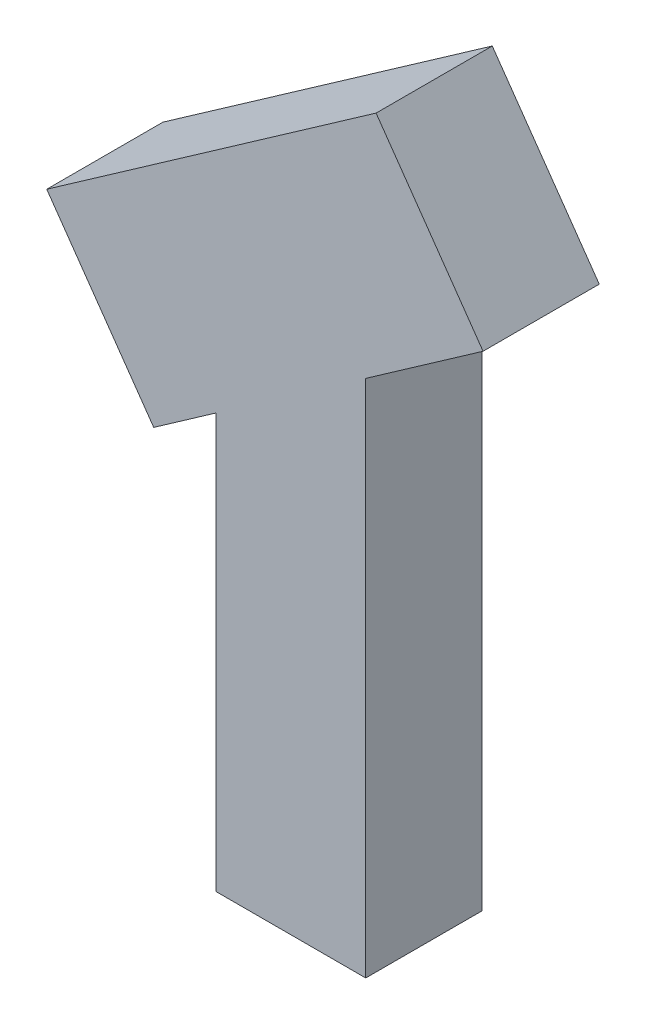
ISO-10303-21;
HEADER;
FILE_DESCRIPTION(('STEP AP214'),'2;1');
FILE_NAME('part.step','',(''),(''),'','','');
FILE_SCHEMA(('AUTOMOTIVE_DESIGN { 1 0 10303 214 1 1 1 1 }'));
ENDSEC;
DATA;
#1=APPLICATION_CONTEXT('core data for automotive mechanical design processes');
#2=APPLICATION_PROTOCOL_DEFINITION('international standard','automotive_design',2000,#1);
#3=PRODUCT_CONTEXT('',#1,'mechanical');
#4=PRODUCT('Part','Part','',(#3));
#5=PRODUCT_RELATED_PRODUCT_CATEGORY('part','',(#4));
#6=PRODUCT_DEFINITION_FORMATION('','',#4);
#7=PRODUCT_DEFINITION_CONTEXT('part definition',#1,'design');
#8=PRODUCT_DEFINITION('design','',#6,#7);
#9=PRODUCT_DEFINITION_SHAPE('','',#8);
#10=(LENGTH_UNIT() NAMED_UNIT(*) SI_UNIT(.MILLI.,.METRE.));
#11=(NAMED_UNIT(*) PLANE_ANGLE_UNIT() SI_UNIT($,.RADIAN.));
#12=(NAMED_UNIT(*) SI_UNIT($,.STERADIAN.) SOLID_ANGLE_UNIT());
#13=UNCERTAINTY_MEASURE_WITH_UNIT(LENGTH_MEASURE(1.E-05),#10,'distance_accuracy_value','');
#14=(GEOMETRIC_REPRESENTATION_CONTEXT(3) GLOBAL_UNCERTAINTY_ASSIGNED_CONTEXT((#13)) GLOBAL_UNIT_ASSIGNED_CONTEXT((#10,
#11,#12)) REPRESENTATION_CONTEXT('',''));
#15=CARTESIAN_POINT('',(0.,0.,0.));
#16=DIRECTION('',(0.,0.,1.));
#17=DIRECTION('',(1.,0.,0.));
#18=AXIS2_PLACEMENT_3D('',#15,#16,#17);
#19=CARTESIAN_POINT('',(-1.07954916287739,-361.,38.));
#20=DIRECTION('',(0.,1.,0.));
#21=DIRECTION('',(0.,0.,1.));
#22=AXIS2_PLACEMENT_3D('',#19,#20,#21);
#23=PLANE('',#22);
#24=DIRECTION('',(1.,0.,0.));
#25=VECTOR('',#24,1.);
#26=CARTESIAN_POINT('',(-1.07954916287739,-361.,-38.));
#27=LINE('',#26,#25);
#28=CARTESIAN_POINT('',(-36.0795491628774,-361.,-38.));
#29=VERTEX_POINT('',#28);
#30=CARTESIAN_POINT('',(61.9204508371226,-361.,-38.));
#31=VERTEX_POINT('',#30);
#32=EDGE_CURVE('E95',#29,#31,#27,.T.);
#33=ORIENTED_EDGE('',*,*,#32,.T.);
#34=DIRECTION('',(0.,0.,-1.));
#35=VECTOR('',#34,1.);
#36=CARTESIAN_POINT('',(61.9204508371226,-361.,38.));
#37=LINE('',#36,#35);
#38=CARTESIAN_POINT('',(61.9204508371226,-361.,38.));
#39=VERTEX_POINT('',#38);
#40=EDGE_CURVE('E174',#39,#31,#37,.T.);
#41=ORIENTED_EDGE('',*,*,#40,.F.);
#42=DIRECTION('',(1.,0.,0.));
#43=VECTOR('',#42,1.);
#44=CARTESIAN_POINT('',(-1.07954916287739,-361.,38.));
#45=LINE('',#44,#43);
#46=CARTESIAN_POINT('',(-36.0795491628774,-361.,38.));
#47=VERTEX_POINT('',#46);
#48=EDGE_CURVE('E101',#47,#39,#45,.T.);
#49=ORIENTED_EDGE('',*,*,#48,.F.);
#50=DIRECTION('',(0.,0.,-1.));
#51=VECTOR('',#50,1.);
#52=CARTESIAN_POINT('',(-36.0795491628774,-361.,38.));
#53=LINE('',#52,#51);
#54=EDGE_CURVE('E142',#47,#29,#53,.T.);
#55=ORIENTED_EDGE('',*,*,#54,.T.);
#56=EDGE_LOOP('',(#33,#41,#49,#55));
#57=FACE_BOUND('',#56,.T.);
#58=ADVANCED_FACE('F39',(#57),#23,.F.);
#59=CARTESIAN_POINT('',(61.9204508371226,-361.,38.));
#60=DIRECTION('',(-1.,0.,0.));
#61=DIRECTION('',(0.,0.,1.));
#62=AXIS2_PLACEMENT_3D('',#59,#60,#61);
#63=PLANE('',#62);
#64=DIRECTION('',(0.,1.,0.));
#65=VECTOR('',#64,1.);
#66=CARTESIAN_POINT('',(61.9204508371226,-361.,-38.));
#67=LINE('',#66,#65);
#68=CARTESIAN_POINT('',(61.9204508371226,-21.313279486295,-38.));
#69=VERTEX_POINT('',#68);
#70=EDGE_CURVE('E147',#31,#69,#67,.T.);
#71=ORIENTED_EDGE('',*,*,#70,.T.);
#72=DIRECTION('',(0.,0.,-1.));
#73=VECTOR('',#72,1.);
#74=CARTESIAN_POINT('',(61.9204508371226,-21.313279486295,38.));
#75=LINE('',#74,#73);
#76=CARTESIAN_POINT('',(61.9204508371226,-21.313279486295,38.));
#77=VERTEX_POINT('',#76);
#78=EDGE_CURVE('E171',#77,#69,#75,.T.);
#79=ORIENTED_EDGE('',*,*,#78,.F.);
#80=DIRECTION('',(0.,1.,0.));
#81=VECTOR('',#80,1.);
#82=CARTESIAN_POINT('',(61.9204508371226,-361.,38.));
#83=LINE('',#82,#81);
#84=EDGE_CURVE('E214',#39,#77,#83,.T.);
#85=ORIENTED_EDGE('',*,*,#84,.F.);
#86=ORIENTED_EDGE('',*,*,#40,.T.);
#87=EDGE_LOOP('',(#71,#79,#85,#86));
#88=FACE_BOUND('',#87,.T.);
#89=ADVANCED_FACE('F235',(#88),#63,.F.);
#90=CARTESIAN_POINT('',(61.9204508371226,-21.313279486295,38.));
#91=DIRECTION('',(-0.573576436351042,0.819152044288995,0.));
#92=DIRECTION('',(-0.819152044288995,-0.573576436351042,0.));
#93=AXIS2_PLACEMENT_3D('',#90,#91,#92);
#94=PLANE('',#93);
#95=DIRECTION('',(0.819152044288995,0.573576436351042,0.));
#96=VECTOR('',#95,1.);
#97=CARTESIAN_POINT('',(61.9204508371226,-21.313279486295,-38.));
#98=LINE('',#97,#96);
#99=CARTESIAN_POINT('',(138.671836045079,32.4286190043527,-38.));
#100=VERTEX_POINT('',#99);
#101=EDGE_CURVE('E150',#69,#100,#98,.T.);
#102=ORIENTED_EDGE('',*,*,#101,.T.);
#103=DIRECTION('',(0.,0.,-1.));
#104=VECTOR('',#103,1.);
#105=CARTESIAN_POINT('',(138.671836045079,32.4286190043527,38.));
#106=LINE('',#105,#104);
#107=CARTESIAN_POINT('',(138.671836045079,32.4286190043527,38.));
#108=VERTEX_POINT('',#107);
#109=EDGE_CURVE('E168',#108,#100,#106,.T.);
#110=ORIENTED_EDGE('',*,*,#109,.F.);
#111=DIRECTION('',(0.819152044288995,0.573576436351042,0.));
#112=VECTOR('',#111,1.);
#113=CARTESIAN_POINT('',(61.9204508371226,-21.313279486295,38.));
#114=LINE('',#113,#112);
#115=EDGE_CURVE('E216',#77,#108,#114,.T.);
#116=ORIENTED_EDGE('',*,*,#115,.F.);
#117=ORIENTED_EDGE('',*,*,#78,.T.);
#118=EDGE_LOOP('',(#102,#110,#116,#117));
#119=FACE_BOUND('',#118,.T.);
#120=ADVANCED_FACE('F238',(#119),#94,.F.);
#121=CARTESIAN_POINT('',(138.671836045079,32.4286190043527,38.));
#122=DIRECTION('',(-0.819152044288995,-0.573576436351042,0.));
#123=DIRECTION('',(0.573576436351042,-0.819152044288995,0.));
#124=AXIS2_PLACEMENT_3D('',#121,#122,#123);
#125=PLANE('',#124);
#126=DIRECTION('',(-0.573576436351042,0.819152044288995,0.));
#127=VECTOR('',#126,1.);
#128=CARTESIAN_POINT('',(138.671836045079,32.4286190043527,-38.));
#129=LINE('',#128,#127);
#130=CARTESIAN_POINT('',(68.6955108102518,132.36516840761,-38.));
#131=VERTEX_POINT('',#130);
#132=EDGE_CURVE('E152',#100,#131,#129,.T.);
#133=ORIENTED_EDGE('',*,*,#132,.T.);
#134=DIRECTION('',(0.,0.,-1.));
#135=VECTOR('',#134,1.);
#136=CARTESIAN_POINT('',(68.6955108102518,132.36516840761,38.));
#137=LINE('',#136,#135);
#138=CARTESIAN_POINT('',(68.6955108102518,132.36516840761,38.));
#139=VERTEX_POINT('',#138);
#140=EDGE_CURVE('E165',#139,#131,#137,.T.);
#141=ORIENTED_EDGE('',*,*,#140,.F.);
#142=DIRECTION('',(-0.573576436351042,0.819152044288995,0.));
#143=VECTOR('',#142,1.);
#144=CARTESIAN_POINT('',(138.671836045079,32.4286190043527,38.));
#145=LINE('',#144,#143);
#146=EDGE_CURVE('E218',#108,#139,#145,.T.);
#147=ORIENTED_EDGE('',*,*,#146,.F.);
#148=ORIENTED_EDGE('',*,*,#109,.T.);
#149=EDGE_LOOP('',(#133,#141,#147,#148));
#150=FACE_BOUND('',#149,.T.);
#151=ADVANCED_FACE('F224',(#150),#125,.F.);
#152=CARTESIAN_POINT('',(68.6955108102518,132.36516840761,38.));
#153=DIRECTION('',(0.573576436351042,-0.819152044288995,0.));
#154=DIRECTION('',(0.819152044288995,0.573576436351042,0.));
#155=AXIS2_PLACEMENT_3D('',#152,#153,#154);
#156=PLANE('',#155);
#157=DIRECTION('',(-0.819152044288994,-0.573576436351042,0.));
#158=VECTOR('',#157,1.);
#159=CARTESIAN_POINT('',(68.6955108102518,132.36516840761,-38.));
#160=LINE('',#159,#158);
#161=CARTESIAN_POINT('',(-146.741476837754,-18.485434352714,-38.));
#162=VERTEX_POINT('',#161);
#163=EDGE_CURVE('E154',#131,#162,#160,.T.);
#164=ORIENTED_EDGE('',*,*,#163,.T.);
#165=DIRECTION('',(0.,0.,-1.));
#166=VECTOR('',#165,1.);
#167=CARTESIAN_POINT('',(-146.741476837754,-18.485434352714,38.));
#168=LINE('',#167,#166);
#169=CARTESIAN_POINT('',(-146.741476837754,-18.485434352714,38.));
#170=VERTEX_POINT('',#169);
#171=EDGE_CURVE('E136',#170,#162,#168,.T.);
#172=ORIENTED_EDGE('',*,*,#171,.F.);
#173=DIRECTION('',(-0.819152044288994,-0.573576436351042,0.));
#174=VECTOR('',#173,1.);
#175=CARTESIAN_POINT('',(68.6955108102518,132.36516840761,38.));
#176=LINE('',#175,#174);
#177=EDGE_CURVE('E124',#139,#170,#176,.T.);
#178=ORIENTED_EDGE('',*,*,#177,.F.);
#179=ORIENTED_EDGE('',*,*,#140,.T.);
#180=EDGE_LOOP('',(#164,#172,#178,#179));
#181=FACE_BOUND('',#180,.T.);
#182=ADVANCED_FACE('F228',(#181),#156,.F.);
#183=CARTESIAN_POINT('',(-146.741476837754,-18.485434352714,38.));
#184=DIRECTION('',(0.819152044288994,0.573576436351042,0.));
#185=DIRECTION('',(-0.573576436351042,0.819152044288994,0.));
#186=AXIS2_PLACEMENT_3D('',#183,#184,#185);
#187=PLANE('',#186);
#188=DIRECTION('',(0.573576436351042,-0.819152044288994,0.));
#189=VECTOR('',#188,1.);
#190=CARTESIAN_POINT('',(-146.741476837754,-18.485434352714,-38.));
#191=LINE('',#190,#189);
#192=CARTESIAN_POINT('',(-76.7651516029266,-118.421983755971,-38.));
#193=VERTEX_POINT('',#192);
#194=EDGE_CURVE('E133',#162,#193,#191,.T.);
#195=ORIENTED_EDGE('',*,*,#194,.T.);
#196=DIRECTION('',(0.,0.,-1.));
#197=VECTOR('',#196,1.);
#198=CARTESIAN_POINT('',(-76.7651516029266,-118.421983755971,38.));
#199=LINE('',#198,#197);
#200=CARTESIAN_POINT('',(-76.7651516029266,-118.421983755971,38.));
#201=VERTEX_POINT('',#200);
#202=EDGE_CURVE('E130',#201,#193,#199,.T.);
#203=ORIENTED_EDGE('',*,*,#202,.F.);
#204=DIRECTION('',(0.573576436351042,-0.819152044288994,0.));
#205=VECTOR('',#204,1.);
#206=CARTESIAN_POINT('',(-146.741476837754,-18.485434352714,38.));
#207=LINE('',#206,#205);
#208=EDGE_CURVE('E117',#170,#201,#207,.T.);
#209=ORIENTED_EDGE('',*,*,#208,.F.);
#210=ORIENTED_EDGE('',*,*,#171,.T.);
#211=EDGE_LOOP('',(#195,#203,#209,#210));
#212=FACE_BOUND('',#211,.T.);
#213=ADVANCED_FACE('F131',(#212),#187,.F.);
#214=CARTESIAN_POINT('',(-76.7651516029266,-118.421983755971,38.));
#215=DIRECTION('',(-0.573576436351042,0.819152044288995,0.));
#216=DIRECTION('',(-0.819152044288995,-0.573576436351042,0.));
#217=AXIS2_PLACEMENT_3D('',#214,#215,#216);
#218=PLANE('',#217);
#219=DIRECTION('',(0.819152044288995,0.573576436351042,0.));
#220=VECTOR('',#219,1.);
#221=CARTESIAN_POINT('',(-76.7651516029266,-118.421983755971,-38.));
#222=LINE('',#221,#220);
#223=CARTESIAN_POINT('',(-36.0795491628774,-89.9336182308458,-38.));
#224=VERTEX_POINT('',#223);
#225=EDGE_CURVE('E157',#193,#224,#222,.T.);
#226=ORIENTED_EDGE('',*,*,#225,.T.);
#227=DIRECTION('',(0.,0.,-1.));
#228=VECTOR('',#227,1.);
#229=CARTESIAN_POINT('',(-36.0795491628774,-89.9336182308458,38.));
#230=LINE('',#229,#228);
#231=CARTESIAN_POINT('',(-36.0795491628774,-89.9336182308458,38.));
#232=VERTEX_POINT('',#231);
#233=EDGE_CURVE('E137',#232,#224,#230,.T.);
#234=ORIENTED_EDGE('',*,*,#233,.F.);
#235=DIRECTION('',(0.819152044288995,0.573576436351042,0.));
#236=VECTOR('',#235,1.);
#237=CARTESIAN_POINT('',(-76.7651516029266,-118.421983755971,38.));
#238=LINE('',#237,#236);
#239=EDGE_CURVE('E121',#201,#232,#238,.T.);
#240=ORIENTED_EDGE('',*,*,#239,.F.);
#241=ORIENTED_EDGE('',*,*,#202,.T.);
#242=EDGE_LOOP('',(#226,#234,#240,#241));
#243=FACE_BOUND('',#242,.T.);
#244=ADVANCED_FACE('F139',(#243),#218,.F.);
#245=CARTESIAN_POINT('',(-36.0795491628774,-89.9336182308458,38.));
#246=DIRECTION('',(1.,0.,0.));
#247=DIRECTION('',(0.,0.,-1.));
#248=AXIS2_PLACEMENT_3D('',#245,#246,#247);
#249=PLANE('',#248);
#250=DIRECTION('',(0.,-1.,0.));
#251=VECTOR('',#250,1.);
#252=CARTESIAN_POINT('',(-36.0795491628774,-89.9336182308458,-38.));
#253=LINE('',#252,#251);
#254=EDGE_CURVE('E159',#224,#29,#253,.T.);
#255=ORIENTED_EDGE('',*,*,#254,.T.);
#256=ORIENTED_EDGE('',*,*,#54,.F.);
#257=DIRECTION('',(0.,-1.,0.));
#258=VECTOR('',#257,1.);
#259=CARTESIAN_POINT('',(-36.0795491628774,-89.9336182308458,38.));
#260=LINE('',#259,#258);
#261=EDGE_CURVE('E62',#232,#47,#260,.T.);
#262=ORIENTED_EDGE('',*,*,#261,.F.);
#263=ORIENTED_EDGE('',*,*,#233,.T.);
#264=EDGE_LOOP('',(#255,#256,#262,#263));
#265=FACE_BOUND('',#264,.T.);
#266=ADVANCED_FACE('F230',(#265),#249,.F.);
#267=CARTESIAN_POINT('',(0.,0.,38.));
#268=DIRECTION('',(0.,0.,1.));
#269=DIRECTION('',(1.,0.,0.));
#270=AXIS2_PLACEMENT_3D('',#267,#268,#269);
#271=PLANE('',#270);
#272=ORIENTED_EDGE('',*,*,#48,.T.);
#273=ORIENTED_EDGE('',*,*,#84,.T.);
#274=ORIENTED_EDGE('',*,*,#115,.T.);
#275=ORIENTED_EDGE('',*,*,#146,.T.);
#276=ORIENTED_EDGE('',*,*,#177,.T.);
#277=ORIENTED_EDGE('',*,*,#208,.T.);
#278=ORIENTED_EDGE('',*,*,#239,.T.);
#279=ORIENTED_EDGE('',*,*,#261,.T.);
#280=EDGE_LOOP('',(#272,#273,#274,#275,#276,#277,#278,#279));
#281=FACE_BOUND('',#280,.T.);
#282=ADVANCED_FACE('F119',(#281),#271,.T.);
#283=CARTESIAN_POINT('',(0.,0.,-38.));
#284=DIRECTION('',(0.,0.,1.));
#285=DIRECTION('',(1.,0.,0.));
#286=AXIS2_PLACEMENT_3D('',#283,#284,#285);
#287=PLANE('',#286);
#288=DIRECTION('',(-0.573576436351042,0.819152044288995,0.));
#289=VECTOR('',#288,1.);
#290=CARTESIAN_POINT('',(81.254648171023,56.8951171639275,-38.));
#291=LINE('',#290,#289);
#292=CARTESIAN_POINT('',(92.9985844021333,40.1230380441606,-38.));
#293=VERTEX_POINT('',#292);
#294=CARTESIAN_POINT('',(60.3047275301239,86.8147045686334,-38.));
#295=VERTEX_POINT('',#294);
#296=EDGE_CURVE('E46',#293,#295,#291,.T.);
#297=ORIENTED_EDGE('',*,*,#296,.T.);
#298=DIRECTION('',(-0.819152044288995,-0.573576436351042,0.));
#299=VECTOR('',#298,1.);
#300=CARTESIAN_POINT('',(-20.9499206408991,29.9195874047058,-38.));
#301=LINE('',#300,#299);
#302=CARTESIAN_POINT('',(-101.068225194808,-26.179853392522,-38.));
#303=VERTEX_POINT('',#302);
#304=EDGE_CURVE('E11',#295,#303,#301,.T.);
#305=ORIENTED_EDGE('',*,*,#304,.T.);
#306=DIRECTION('',(0.573576436351043,-0.819152044288994,0.));
#307=VECTOR('',#306,1.);
#308=CARTESIAN_POINT('',(-80.1183045539089,-56.0994407972278,-38.));
#309=LINE('',#308,#307);
#310=CARTESIAN_POINT('',(-68.3743683227986,-72.8715199169947,-38.));
#311=VERTEX_POINT('',#310);
#312=EDGE_CURVE('E177',#303,#311,#309,.T.);
#313=ORIENTED_EDGE('',*,*,#312,.T.);
#314=DIRECTION('',(0.819152044288995,0.573576436351042,0.));
#315=VECTOR('',#314,1.);
#316=CARTESIAN_POINT('',(11.7439362311103,-16.7720791197669,-38.));
#317=LINE('',#316,#315);
#318=EDGE_CURVE('E180',#311,#293,#317,.T.);
#319=ORIENTED_EDGE('',*,*,#318,.T.);
#320=EDGE_LOOP('',(#297,#305,#313,#319));
#321=FACE_BOUND('',#320,.T.);
#322=ORIENTED_EDGE('',*,*,#32,.F.);
#323=ORIENTED_EDGE('',*,*,#254,.F.);
#324=ORIENTED_EDGE('',*,*,#225,.F.);
#325=ORIENTED_EDGE('',*,*,#194,.F.);
#326=ORIENTED_EDGE('',*,*,#163,.F.);
#327=ORIENTED_EDGE('',*,*,#132,.F.);
#328=ORIENTED_EDGE('',*,*,#101,.F.);
#329=ORIENTED_EDGE('',*,*,#70,.F.);
#330=EDGE_LOOP('',(#322,#323,#324,#325,#326,#327,#328,#329));
#331=FACE_BOUND('',#330,.T.);
#332=ADVANCED_FACE('F185',(#321,#331),#287,.F.);
#333=CARTESIAN_POINT('',(-20.9499206408991,29.9195874047058,-49.));
#334=DIRECTION('',(-0.573576436351042,0.819152044288995,0.));
#335=DIRECTION('',(-0.819152044288995,-0.573576436351042,0.));
#336=AXIS2_PLACEMENT_3D('',#333,#334,#335);
#337=PLANE('',#336);
#338=DIRECTION('',(0.,0.,1.));
#339=VECTOR('',#338,1.);
#340=CARTESIAN_POINT('',(60.3047275301239,86.8147045686334,-49.));
#341=LINE('',#340,#339);
#342=CARTESIAN_POINT('',(60.3047275301239,86.8147045686334,-27.));
#343=VERTEX_POINT('',#342);
#344=EDGE_CURVE('E148',#295,#343,#341,.T.);
#345=ORIENTED_EDGE('',*,*,#344,.T.);
#346=DIRECTION('',(-0.819152044288995,-0.573576436351042,0.));
#347=VECTOR('',#346,1.);
#348=CARTESIAN_POINT('',(-20.9499206408991,29.9195874047058,-27.));
#349=LINE('',#348,#347);
#350=CARTESIAN_POINT('',(-101.068225194808,-26.179853392522,-27.));
#351=VERTEX_POINT('',#350);
#352=EDGE_CURVE('E399',#343,#351,#349,.T.);
#353=ORIENTED_EDGE('',*,*,#352,.T.);
#354=DIRECTION('',(0.,0.,1.));
#355=VECTOR('',#354,1.);
#356=CARTESIAN_POINT('',(-101.068225194808,-26.179853392522,-49.));
#357=LINE('',#356,#355);
#358=EDGE_CURVE('E206',#303,#351,#357,.T.);
#359=ORIENTED_EDGE('',*,*,#358,.F.);
#360=ORIENTED_EDGE('',*,*,#304,.F.);
#361=EDGE_LOOP('',(#345,#353,#359,#360));
#362=FACE_BOUND('',#361,.T.);
#363=ADVANCED_FACE('F320',(#362),#337,.F.);
#364=CARTESIAN_POINT('',(81.254648171023,56.8951171639275,-49.));
#365=DIRECTION('',(0.819152044288995,0.573576436351042,0.));
#366=DIRECTION('',(-0.573576436351042,0.819152044288995,0.));
#367=AXIS2_PLACEMENT_3D('',#364,#365,#366);
#368=PLANE('',#367);
#369=DIRECTION('',(0.,0.,1.));
#370=VECTOR('',#369,1.);
#371=CARTESIAN_POINT('',(92.9985844021333,40.1230380441606,-49.));
#372=LINE('',#371,#370);
#373=CARTESIAN_POINT('',(92.9985844021333,40.1230380441606,-27.));
#374=VERTEX_POINT('',#373);
#375=EDGE_CURVE('E196',#293,#374,#372,.T.);
#376=ORIENTED_EDGE('',*,*,#375,.T.);
#377=DIRECTION('',(-0.573576436351042,0.819152044288995,0.));
#378=VECTOR('',#377,1.);
#379=CARTESIAN_POINT('',(81.254648171023,56.8951171639275,-27.));
#380=LINE('',#379,#378);
#381=EDGE_CURVE('E212',#374,#343,#380,.T.);
#382=ORIENTED_EDGE('',*,*,#381,.T.);
#383=ORIENTED_EDGE('',*,*,#344,.F.);
#384=ORIENTED_EDGE('',*,*,#296,.F.);
#385=EDGE_LOOP('',(#376,#382,#383,#384));
#386=FACE_BOUND('',#385,.T.);
#387=ADVANCED_FACE('F193',(#386),#368,.F.);
#388=CARTESIAN_POINT('',(11.7439362311103,-16.7720791197669,-49.));
#389=DIRECTION('',(0.573576436351042,-0.819152044288995,0.));
#390=DIRECTION('',(0.819152044288995,0.573576436351042,0.));
#391=AXIS2_PLACEMENT_3D('',#388,#389,#390);
#392=PLANE('',#391);
#393=DIRECTION('',(0.,0.,1.));
#394=VECTOR('',#393,1.);
#395=CARTESIAN_POINT('',(-68.3743683227986,-72.8715199169947,-49.));
#396=LINE('',#395,#394);
#397=CARTESIAN_POINT('',(-68.3743683227986,-72.8715199169947,-27.));
#398=VERTEX_POINT('',#397);
#399=EDGE_CURVE('E53',#311,#398,#396,.T.);
#400=ORIENTED_EDGE('',*,*,#399,.T.);
#401=DIRECTION('',(0.819152044288995,0.573576436351042,0.));
#402=VECTOR('',#401,1.);
#403=CARTESIAN_POINT('',(11.7439362311103,-16.7720791197669,-27.));
#404=LINE('',#403,#402);
#405=EDGE_CURVE('E202',#398,#374,#404,.T.);
#406=ORIENTED_EDGE('',*,*,#405,.T.);
#407=ORIENTED_EDGE('',*,*,#375,.F.);
#408=ORIENTED_EDGE('',*,*,#318,.F.);
#409=EDGE_LOOP('',(#400,#406,#407,#408));
#410=FACE_BOUND('',#409,.T.);
#411=ADVANCED_FACE('F200',(#410),#392,.F.);
#412=CARTESIAN_POINT('',(-80.1183045539089,-56.0994407972278,-49.));
#413=DIRECTION('',(-0.819152044288994,-0.573576436351043,0.));
#414=DIRECTION('',(0.573576436351043,-0.819152044288994,0.));
#415=AXIS2_PLACEMENT_3D('',#412,#413,#414);
#416=PLANE('',#415);
#417=ORIENTED_EDGE('',*,*,#358,.T.);
#418=DIRECTION('',(0.573576436351043,-0.819152044288994,0.));
#419=VECTOR('',#418,1.);
#420=CARTESIAN_POINT('',(-80.1183045539089,-56.0994407972278,-27.));
#421=LINE('',#420,#419);
#422=EDGE_CURVE('E401',#351,#398,#421,.T.);
#423=ORIENTED_EDGE('',*,*,#422,.T.);
#424=ORIENTED_EDGE('',*,*,#399,.F.);
#425=ORIENTED_EDGE('',*,*,#312,.F.);
#426=EDGE_LOOP('',(#417,#423,#424,#425));
#427=FACE_BOUND('',#426,.T.);
#428=ADVANCED_FACE('F349',(#427),#416,.F.);
#429=CARTESIAN_POINT('',(0.,0.,-27.));
#430=DIRECTION('',(0.,0.,1.));
#431=DIRECTION('',(1.,0.,0.));
#432=AXIS2_PLACEMENT_3D('',#429,#430,#431);
#433=PLANE('',#432);
#434=ORIENTED_EDGE('',*,*,#352,.F.);
#435=ORIENTED_EDGE('',*,*,#381,.F.);
#436=ORIENTED_EDGE('',*,*,#405,.F.);
#437=ORIENTED_EDGE('',*,*,#422,.F.);
#438=EDGE_LOOP('',(#434,#435,#436,#437));
#439=FACE_BOUND('',#438,.T.);
#440=ADVANCED_FACE('F359',(#439),#433,.F.);
#441=CLOSED_SHELL('',(#58,#89,#120,#151,#182,#213,#244,#266,#282,#332,#363,#387,#411,#428,#440));
#442=MANIFOLD_SOLID_BREP('B2',#441);
#443=ADVANCED_BREP_SHAPE_REPRESENTATION('',(#18,#442),#14);
#444=SHAPE_DEFINITION_REPRESENTATION(#9,#443);
ENDSEC;
END-ISO-10303-21;
